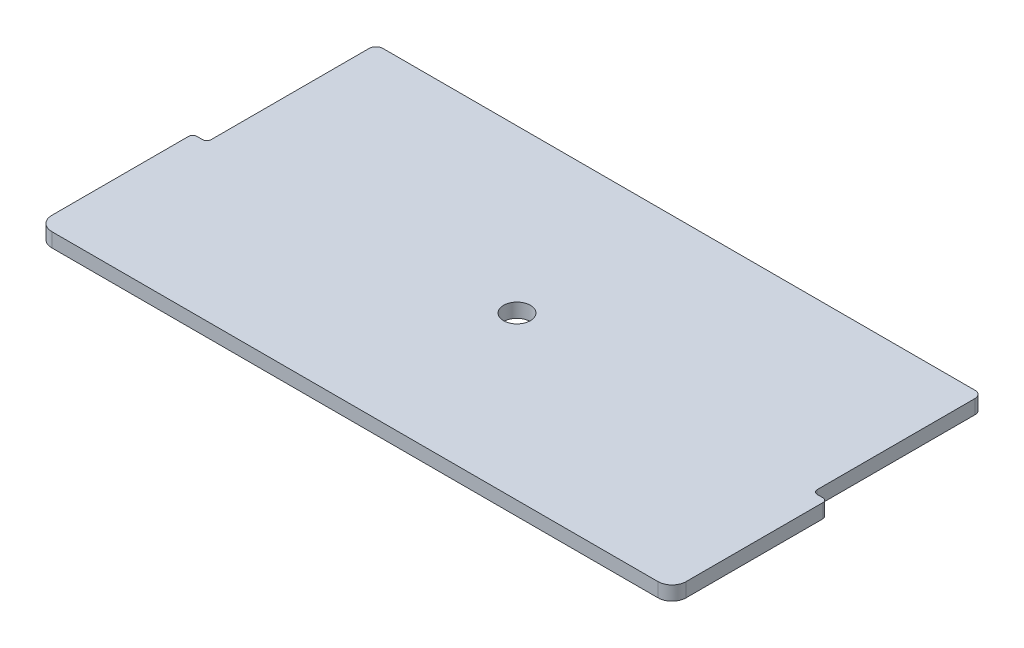
ISO-10303-21;
HEADER;
FILE_DESCRIPTION(('STEP AP214'),'2;1');
FILE_NAME('part.step','',(''),(''),'','','');
FILE_SCHEMA(('AUTOMOTIVE_DESIGN { 1 0 10303 214 1 1 1 1 }'));
ENDSEC;
DATA;
#1=APPLICATION_CONTEXT('core data for automotive mechanical design processes');
#2=APPLICATION_PROTOCOL_DEFINITION('international standard','automotive_design',2000,#1);
#3=PRODUCT_CONTEXT('',#1,'mechanical');
#4=PRODUCT('Part','Part','',(#3));
#5=PRODUCT_RELATED_PRODUCT_CATEGORY('part','',(#4));
#6=PRODUCT_DEFINITION_FORMATION('','',#4);
#7=PRODUCT_DEFINITION_CONTEXT('part definition',#1,'design');
#8=PRODUCT_DEFINITION('design','',#6,#7);
#9=PRODUCT_DEFINITION_SHAPE('','',#8);
#10=(LENGTH_UNIT() NAMED_UNIT(*) SI_UNIT(.MILLI.,.METRE.));
#11=(NAMED_UNIT(*) PLANE_ANGLE_UNIT() SI_UNIT($,.RADIAN.));
#12=(NAMED_UNIT(*) SI_UNIT($,.STERADIAN.) SOLID_ANGLE_UNIT());
#13=UNCERTAINTY_MEASURE_WITH_UNIT(LENGTH_MEASURE(1.E-05),#10,'distance_accuracy_value','');
#14=(GEOMETRIC_REPRESENTATION_CONTEXT(3) GLOBAL_UNCERTAINTY_ASSIGNED_CONTEXT((#13)) GLOBAL_UNIT_ASSIGNED_CONTEXT((#10,
#11,#12)) REPRESENTATION_CONTEXT('',''));
#15=CARTESIAN_POINT('',(0.,0.,0.));
#16=DIRECTION('',(0.,0.,1.));
#17=DIRECTION('',(1.,0.,0.));
#18=AXIS2_PLACEMENT_3D('',#15,#16,#17);
#19=CARTESIAN_POINT('',(-48.1701466086975,10.,-30.928495364833));
#20=DIRECTION('',(1.,0.,0.));
#21=DIRECTION('',(0.,0.,-1.));
#22=AXIS2_PLACEMENT_3D('',#19,#20,#21);
#23=PLANE('',#22);
#24=DIRECTION('',(0.,0.,1.));
#25=VECTOR('',#24,1.);
#26=CARTESIAN_POINT('',(-48.1701466086975,10.,-30.928495364833));
#27=LINE('',#26,#25);
#28=CARTESIAN_POINT('',(-48.1701466086974,10.,92.071504635167));
#29=VERTEX_POINT('',#28);
#30=CARTESIAN_POINT('',(-48.1701466086974,10.,189.071504635167));
#31=VERTEX_POINT('',#30);
#32=EDGE_CURVE('E174',#29,#31,#27,.T.);
#33=ORIENTED_EDGE('',*,*,#32,.F.);
#34=DIRECTION('',(0.,1.,0.));
#35=VECTOR('',#34,1.);
#36=CARTESIAN_POINT('',(-48.1701466086974,10.,92.071504635167));
#37=LINE('',#36,#35);
#38=CARTESIAN_POINT('',(-48.1701466086974,0.,92.071504635167));
#39=VERTEX_POINT('',#38);
#40=EDGE_CURVE('E200',#29,#39,#37,.F.);
#41=ORIENTED_EDGE('',*,*,#40,.T.);
#42=DIRECTION('',(0.,0.,1.));
#43=VECTOR('',#42,1.);
#44=CARTESIAN_POINT('',(-48.1701466086975,0.,-30.928495364833));
#45=LINE('',#44,#43);
#46=CARTESIAN_POINT('',(-48.1701466086974,0.,189.071504635167));
#47=VERTEX_POINT('',#46);
#48=EDGE_CURVE('E164',#39,#47,#45,.T.);
#49=ORIENTED_EDGE('',*,*,#48,.T.);
#50=DIRECTION('',(0.,-1.,0.));
#51=VECTOR('',#50,1.);
#52=CARTESIAN_POINT('',(-48.1701466086974,10.,189.071504635167));
#53=LINE('',#52,#51);
#54=EDGE_CURVE('E154',#47,#31,#53,.F.);
#55=ORIENTED_EDGE('',*,*,#54,.T.);
#56=EDGE_LOOP('',(#33,#41,#49,#55));
#57=FACE_BOUND('',#56,.T.);
#58=ADVANCED_FACE('F34',(#57),#23,.F.);
#59=CARTESIAN_POINT('',(-48.1701466086974,10.,199.071504635167));
#60=DIRECTION('',(0.,0.,-1.));
#61=DIRECTION('',(-1.,0.,0.));
#62=AXIS2_PLACEMENT_3D('',#59,#60,#61);
#63=PLANE('',#62);
#64=DIRECTION('',(1.,0.,0.));
#65=VECTOR('',#64,1.);
#66=CARTESIAN_POINT('',(-48.1701466086974,0.,199.071504635167));
#67=LINE('',#66,#65);
#68=CARTESIAN_POINT('',(-38.1701466086974,0.,199.071504635167));
#69=VERTEX_POINT('',#68);
#70=CARTESIAN_POINT('',(391.829853391303,0.,199.071504635167));
#71=VERTEX_POINT('',#70);
#72=EDGE_CURVE('E158',#69,#71,#67,.T.);
#73=ORIENTED_EDGE('',*,*,#72,.T.);
#74=DIRECTION('',(0.,-1.,0.));
#75=VECTOR('',#74,1.);
#76=CARTESIAN_POINT('',(391.829853391303,10.,199.071504635167));
#77=LINE('',#76,#75);
#78=CARTESIAN_POINT('',(391.829853391303,10.,199.071504635167));
#79=VERTEX_POINT('',#78);
#80=EDGE_CURVE('E42',#71,#79,#77,.F.);
#81=ORIENTED_EDGE('',*,*,#80,.T.);
#82=DIRECTION('',(1.,0.,0.));
#83=VECTOR('',#82,1.);
#84=CARTESIAN_POINT('',(-48.1701466086974,10.,199.071504635167));
#85=LINE('',#84,#83);
#86=CARTESIAN_POINT('',(-38.1701466086974,10.,199.071504635167));
#87=VERTEX_POINT('',#86);
#88=EDGE_CURVE('E159',#87,#79,#85,.T.);
#89=ORIENTED_EDGE('',*,*,#88,.F.);
#90=DIRECTION('',(0.,-1.,0.));
#91=VECTOR('',#90,1.);
#92=CARTESIAN_POINT('',(-38.1701466086974,10.,199.071504635167));
#93=LINE('',#92,#91);
#94=EDGE_CURVE('E152',#87,#69,#93,.T.);
#95=ORIENTED_EDGE('',*,*,#94,.T.);
#96=EDGE_LOOP('',(#73,#81,#89,#95));
#97=FACE_BOUND('',#96,.T.);
#98=ADVANCED_FACE('F157',(#97),#63,.F.);
#99=CARTESIAN_POINT('',(401.829853391302,10.,-30.928495364833));
#100=DIRECTION('',(-1.,0.,0.));
#101=DIRECTION('',(0.,0.,1.));
#102=AXIS2_PLACEMENT_3D('',#99,#100,#101);
#103=PLANE('',#102);
#104=DIRECTION('',(0.,0.,-1.));
#105=VECTOR('',#104,1.);
#106=CARTESIAN_POINT('',(401.829853391302,10.,-30.928495364833));
#107=LINE('',#106,#105);
#108=CARTESIAN_POINT('',(401.829853391303,10.,189.071504635167));
#109=VERTEX_POINT('',#108);
#110=CARTESIAN_POINT('',(401.829853391303,10.,92.071504635167));
#111=VERTEX_POINT('',#110);
#112=EDGE_CURVE('E252',#109,#111,#107,.T.);
#113=ORIENTED_EDGE('',*,*,#112,.F.);
#114=DIRECTION('',(0.,-1.,0.));
#115=VECTOR('',#114,1.);
#116=CARTESIAN_POINT('',(401.829853391303,10.,189.071504635167));
#117=LINE('',#116,#115);
#118=CARTESIAN_POINT('',(401.829853391303,0.,189.071504635167));
#119=VERTEX_POINT('',#118);
#120=EDGE_CURVE('E245',#109,#119,#117,.T.);
#121=ORIENTED_EDGE('',*,*,#120,.T.);
#122=DIRECTION('',(0.,0.,-1.));
#123=VECTOR('',#122,1.);
#124=CARTESIAN_POINT('',(401.829853391302,0.,-30.928495364833));
#125=LINE('',#124,#123);
#126=CARTESIAN_POINT('',(401.829853391303,0.,92.071504635167));
#127=VERTEX_POINT('',#126);
#128=EDGE_CURVE('E163',#119,#127,#125,.T.);
#129=ORIENTED_EDGE('',*,*,#128,.T.);
#130=DIRECTION('',(0.,1.,0.));
#131=VECTOR('',#130,1.);
#132=CARTESIAN_POINT('',(401.829853391303,10.,92.071504635167));
#133=LINE('',#132,#131);
#134=EDGE_CURVE('E226',#127,#111,#133,.T.);
#135=ORIENTED_EDGE('',*,*,#134,.T.);
#136=EDGE_LOOP('',(#113,#121,#129,#135));
#137=FACE_BOUND('',#136,.T.);
#138=ADVANCED_FACE('F251',(#137),#103,.F.);
#139=CARTESIAN_POINT('',(-48.1701466086975,10.,-30.928495364833));
#140=DIRECTION('',(0.,0.,1.));
#141=DIRECTION('',(1.,0.,0.));
#142=AXIS2_PLACEMENT_3D('',#139,#140,#141);
#143=PLANE('',#142);
#144=DIRECTION('',(-1.,0.,0.));
#145=VECTOR('',#144,1.);
#146=CARTESIAN_POINT('',(-48.1701466086975,10.,-30.928495364833));
#147=LINE('',#146,#145);
#148=CARTESIAN_POINT('',(386.829853391303,10.,-30.928495364833));
#149=VERTEX_POINT('',#148);
#150=CARTESIAN_POINT('',(-33.1701466086975,10.,-30.928495364833));
#151=VERTEX_POINT('',#150);
#152=EDGE_CURVE('E179',#149,#151,#147,.T.);
#153=ORIENTED_EDGE('',*,*,#152,.F.);
#154=DIRECTION('',(0.,1.,0.));
#155=VECTOR('',#154,1.);
#156=CARTESIAN_POINT('',(386.829853391303,10.,-30.928495364833));
#157=LINE('',#156,#155);
#158=CARTESIAN_POINT('',(386.829853391303,0.,-30.928495364833));
#159=VERTEX_POINT('',#158);
#160=EDGE_CURVE('E218',#149,#159,#157,.F.);
#161=ORIENTED_EDGE('',*,*,#160,.T.);
#162=DIRECTION('',(-1.,0.,0.));
#163=VECTOR('',#162,1.);
#164=CARTESIAN_POINT('',(-48.1701466086975,0.,-30.928495364833));
#165=LINE('',#164,#163);
#166=CARTESIAN_POINT('',(-33.1701466086975,0.,-30.928495364833));
#167=VERTEX_POINT('',#166);
#168=EDGE_CURVE('E166',#159,#167,#165,.T.);
#169=ORIENTED_EDGE('',*,*,#168,.T.);
#170=DIRECTION('',(0.,1.,0.));
#171=VECTOR('',#170,1.);
#172=CARTESIAN_POINT('',(-33.1701466086975,10.,-30.928495364833));
#173=LINE('',#172,#171);
#174=EDGE_CURVE('E215',#167,#151,#173,.T.);
#175=ORIENTED_EDGE('',*,*,#174,.T.);
#176=EDGE_LOOP('',(#153,#161,#169,#175));
#177=FACE_BOUND('',#176,.T.);
#178=ADVANCED_FACE('F289',(#177),#143,.F.);
#179=CARTESIAN_POINT('',(0.,10.,0.));
#180=DIRECTION('',(0.,1.,0.));
#181=DIRECTION('',(0.,0.,1.));
#182=AXIS2_PLACEMENT_3D('',#179,#180,#181);
#183=PLANE('',#182);
#184=CARTESIAN_POINT('',(176.829853391303,10.,84.071504635167));
#185=DIRECTION('',(0.,1.,0.));
#186=DIRECTION('',(0.,0.,1.));
#187=AXIS2_PLACEMENT_3D('',#184,#185,#186);
#188=CIRCLE('',#187,9.50000000000001);
#189=CARTESIAN_POINT('',(176.829853391303,10.,93.571504635167));
#190=VERTEX_POINT('',#189);
#191=EDGE_CURVE('E445',#190,#190,#188,.T.);
#192=ORIENTED_EDGE('',*,*,#191,.F.);
#193=EDGE_LOOP('',(#192));
#194=FACE_BOUND('',#193,.T.);
#195=ORIENTED_EDGE('',*,*,#88,.T.);
#196=CARTESIAN_POINT('',(391.829853391303,10.,189.071504635167));
#197=DIRECTION('',(0.,1.,0.));
#198=DIRECTION('',(0.,0.,1.));
#199=AXIS2_PLACEMENT_3D('',#196,#197,#198);
#200=CIRCLE('',#199,10.);
#201=EDGE_CURVE('E11',#79,#109,#200,.T.);
#202=ORIENTED_EDGE('',*,*,#201,.T.);
#203=ORIENTED_EDGE('',*,*,#112,.T.);
#204=CARTESIAN_POINT('',(398.829853391303,10.,92.071504635167));
#205=DIRECTION('',(0.,1.,0.));
#206=DIRECTION('',(0.,0.,1.));
#207=AXIS2_PLACEMENT_3D('',#204,#205,#206);
#208=CIRCLE('',#207,3.);
#209=CARTESIAN_POINT('',(398.829853391303,10.,89.071504635167));
#210=VERTEX_POINT('',#209);
#211=EDGE_CURVE('E229',#111,#210,#208,.T.);
#212=ORIENTED_EDGE('',*,*,#211,.T.);
#213=DIRECTION('',(1.,0.,0.));
#214=VECTOR('',#213,1.);
#215=CARTESIAN_POINT('',(401.829853391303,10.,89.071504635167));
#216=LINE('',#215,#214);
#217=CARTESIAN_POINT('',(394.829853391303,10.,89.071504635167));
#218=VERTEX_POINT('',#217);
#219=EDGE_CURVE('E266',#218,#210,#216,.T.);
#220=ORIENTED_EDGE('',*,*,#219,.F.);
#221=CARTESIAN_POINT('',(394.829853391303,10.,86.071504635167));
#222=DIRECTION('',(0.,1.,0.));
#223=DIRECTION('',(0.,0.,1.));
#224=AXIS2_PLACEMENT_3D('',#221,#222,#223);
#225=CIRCLE('',#224,3.);
#226=CARTESIAN_POINT('',(391.829853391303,10.,86.071504635167));
#227=VERTEX_POINT('',#226);
#228=EDGE_CURVE('E241',#218,#227,#225,.F.);
#229=ORIENTED_EDGE('',*,*,#228,.T.);
#230=DIRECTION('',(0.,0.,1.));
#231=VECTOR('',#230,1.);
#232=CARTESIAN_POINT('',(391.829853391303,10.,89.071504635167));
#233=LINE('',#232,#231);
#234=CARTESIAN_POINT('',(391.829853391303,10.,-25.928495364833));
#235=VERTEX_POINT('',#234);
#236=EDGE_CURVE('E271',#235,#227,#233,.T.);
#237=ORIENTED_EDGE('',*,*,#236,.F.);
#238=CARTESIAN_POINT('',(386.829853391303,10.,-25.928495364833));
#239=DIRECTION('',(0.,1.,0.));
#240=DIRECTION('',(0.,0.,1.));
#241=AXIS2_PLACEMENT_3D('',#238,#239,#240);
#242=CIRCLE('',#241,5.);
#243=EDGE_CURVE('E213',#235,#149,#242,.T.);
#244=ORIENTED_EDGE('',*,*,#243,.T.);
#245=ORIENTED_EDGE('',*,*,#152,.T.);
#246=CARTESIAN_POINT('',(-33.1701466086975,10.,-25.928495364833));
#247=DIRECTION('',(0.,1.,0.));
#248=DIRECTION('',(0.,0.,1.));
#249=AXIS2_PLACEMENT_3D('',#246,#247,#248);
#250=CIRCLE('',#249,5.);
#251=CARTESIAN_POINT('',(-38.1701466086975,10.,-25.928495364833));
#252=VERTEX_POINT('',#251);
#253=EDGE_CURVE('E211',#151,#252,#250,.T.);
#254=ORIENTED_EDGE('',*,*,#253,.T.);
#255=DIRECTION('',(0.,0.,-1.));
#256=VECTOR('',#255,1.);
#257=CARTESIAN_POINT('',(-38.1701466086975,10.,-30.928495364833));
#258=LINE('',#257,#256);
#259=CARTESIAN_POINT('',(-38.1701466086974,10.,86.071504635167));
#260=VERTEX_POINT('',#259);
#261=EDGE_CURVE('E168',#260,#252,#258,.T.);
#262=ORIENTED_EDGE('',*,*,#261,.F.);
#263=CARTESIAN_POINT('',(-41.1701466086974,10.,86.071504635167));
#264=DIRECTION('',(0.,1.,0.));
#265=DIRECTION('',(0.,0.,1.));
#266=AXIS2_PLACEMENT_3D('',#263,#264,#265);
#267=CIRCLE('',#266,3.);
#268=CARTESIAN_POINT('',(-41.1701466086974,10.,89.071504635167));
#269=VERTEX_POINT('',#268);
#270=EDGE_CURVE('E204',#260,#269,#267,.F.);
#271=ORIENTED_EDGE('',*,*,#270,.T.);
#272=DIRECTION('',(1.,0.,0.));
#273=VECTOR('',#272,1.);
#274=CARTESIAN_POINT('',(-48.1701466086974,10.,89.071504635167));
#275=LINE('',#274,#273);
#276=CARTESIAN_POINT('',(-45.1701466086974,10.,89.071504635167));
#277=VERTEX_POINT('',#276);
#278=EDGE_CURVE('E270',#277,#269,#275,.T.);
#279=ORIENTED_EDGE('',*,*,#278,.F.);
#280=CARTESIAN_POINT('',(-45.1701466086974,10.,92.071504635167));
#281=DIRECTION('',(0.,1.,0.));
#282=DIRECTION('',(0.,0.,1.));
#283=AXIS2_PLACEMENT_3D('',#280,#281,#282);
#284=CIRCLE('',#283,3.);
#285=EDGE_CURVE('E198',#277,#29,#284,.T.);
#286=ORIENTED_EDGE('',*,*,#285,.T.);
#287=ORIENTED_EDGE('',*,*,#32,.T.);
#288=CARTESIAN_POINT('',(-38.1701466086974,10.,189.071504635167));
#289=DIRECTION('',(0.,1.,0.));
#290=DIRECTION('',(0.,0.,1.));
#291=AXIS2_PLACEMENT_3D('',#288,#289,#290);
#292=CIRCLE('',#291,10.);
#293=EDGE_CURVE('E188',#31,#87,#292,.T.);
#294=ORIENTED_EDGE('',*,*,#293,.T.);
#295=EDGE_LOOP('',(#195,#202,#203,#212,#220,#229,#237,#244,#245,#254,#262,#271,#279,#286,#287,#294));
#296=FACE_BOUND('',#295,.T.);
#297=ADVANCED_FACE('F265',(#194,#296),#183,.T.);
#298=CARTESIAN_POINT('',(0.,0.,0.));
#299=DIRECTION('',(0.,1.,0.));
#300=DIRECTION('',(0.,0.,1.));
#301=AXIS2_PLACEMENT_3D('',#298,#299,#300);
#302=PLANE('',#301);
#303=CARTESIAN_POINT('',(176.829853391303,0.,84.071504635167));
#304=DIRECTION('',(0.,1.,0.));
#305=DIRECTION('',(0.,0.,1.));
#306=AXIS2_PLACEMENT_3D('',#303,#304,#305);
#307=CIRCLE('',#306,9.50000000000001);
#308=CARTESIAN_POINT('',(176.829853391303,0.,93.571504635167));
#309=VERTEX_POINT('',#308);
#310=EDGE_CURVE('E276',#309,#309,#307,.T.);
#311=ORIENTED_EDGE('',*,*,#310,.T.);
#312=EDGE_LOOP('',(#311));
#313=FACE_BOUND('',#312,.T.);
#314=ORIENTED_EDGE('',*,*,#128,.F.);
#315=CARTESIAN_POINT('',(391.829853391303,0.,189.071504635167));
#316=DIRECTION('',(0.,1.,0.));
#317=DIRECTION('',(0.,0.,1.));
#318=AXIS2_PLACEMENT_3D('',#315,#316,#317);
#319=CIRCLE('',#318,10.);
#320=EDGE_CURVE('E56',#119,#71,#319,.F.);
#321=ORIENTED_EDGE('',*,*,#320,.T.);
#322=ORIENTED_EDGE('',*,*,#72,.F.);
#323=CARTESIAN_POINT('',(-38.1701466086974,0.,189.071504635167));
#324=DIRECTION('',(0.,1.,0.));
#325=DIRECTION('',(0.,0.,1.));
#326=AXIS2_PLACEMENT_3D('',#323,#324,#325);
#327=CIRCLE('',#326,10.);
#328=EDGE_CURVE('E148',#69,#47,#327,.F.);
#329=ORIENTED_EDGE('',*,*,#328,.T.);
#330=ORIENTED_EDGE('',*,*,#48,.F.);
#331=CARTESIAN_POINT('',(-45.1701466086974,0.,92.071504635167));
#332=DIRECTION('',(0.,1.,0.));
#333=DIRECTION('',(0.,0.,1.));
#334=AXIS2_PLACEMENT_3D('',#331,#332,#333);
#335=CIRCLE('',#334,3.);
#336=CARTESIAN_POINT('',(-45.1701466086974,0.,89.071504635167));
#337=VERTEX_POINT('',#336);
#338=EDGE_CURVE('E202',#39,#337,#335,.F.);
#339=ORIENTED_EDGE('',*,*,#338,.T.);
#340=DIRECTION('',(1.,0.,0.));
#341=VECTOR('',#340,1.);
#342=CARTESIAN_POINT('',(-1.23611544104961E-13,0.,89.0715046351671));
#343=LINE('',#342,#341);
#344=CARTESIAN_POINT('',(-41.1701466086974,0.,89.071504635167));
#345=VERTEX_POINT('',#344);
#346=EDGE_CURVE('E182',#337,#345,#343,.T.);
#347=ORIENTED_EDGE('',*,*,#346,.T.);
#348=CARTESIAN_POINT('',(-41.1701466086974,0.,86.071504635167));
#349=DIRECTION('',(0.,1.,0.));
#350=DIRECTION('',(0.,0.,1.));
#351=AXIS2_PLACEMENT_3D('',#348,#349,#350);
#352=CIRCLE('',#351,3.);
#353=CARTESIAN_POINT('',(-38.1701466086974,0.,86.071504635167));
#354=VERTEX_POINT('',#353);
#355=EDGE_CURVE('E206',#345,#354,#352,.T.);
#356=ORIENTED_EDGE('',*,*,#355,.T.);
#357=DIRECTION('',(0.,0.,-1.));
#358=VECTOR('',#357,1.);
#359=CARTESIAN_POINT('',(-38.1701466086974,0.,0.));
#360=LINE('',#359,#358);
#361=CARTESIAN_POINT('',(-38.1701466086974,0.,-25.928495364833));
#362=VERTEX_POINT('',#361);
#363=EDGE_CURVE('E160',#354,#362,#360,.T.);
#364=ORIENTED_EDGE('',*,*,#363,.T.);
#365=CARTESIAN_POINT('',(-33.1701466086975,0.,-25.928495364833));
#366=DIRECTION('',(0.,1.,0.));
#367=DIRECTION('',(0.,0.,1.));
#368=AXIS2_PLACEMENT_3D('',#365,#366,#367);
#369=CIRCLE('',#368,5.);
#370=EDGE_CURVE('E220',#362,#167,#369,.F.);
#371=ORIENTED_EDGE('',*,*,#370,.T.);
#372=ORIENTED_EDGE('',*,*,#168,.F.);
#373=CARTESIAN_POINT('',(386.829853391303,0.,-25.928495364833));
#374=DIRECTION('',(0.,1.,0.));
#375=DIRECTION('',(0.,0.,1.));
#376=AXIS2_PLACEMENT_3D('',#373,#374,#375);
#377=CIRCLE('',#376,5.);
#378=CARTESIAN_POINT('',(391.829853391303,0.,-25.928495364833));
#379=VERTEX_POINT('',#378);
#380=EDGE_CURVE('E222',#159,#379,#377,.F.);
#381=ORIENTED_EDGE('',*,*,#380,.T.);
#382=DIRECTION('',(0.,0.,1.));
#383=VECTOR('',#382,1.);
#384=CARTESIAN_POINT('',(391.829853391303,0.,0.));
#385=LINE('',#384,#383);
#386=CARTESIAN_POINT('',(391.829853391303,0.,86.071504635167));
#387=VERTEX_POINT('',#386);
#388=EDGE_CURVE('E175',#379,#387,#385,.T.);
#389=ORIENTED_EDGE('',*,*,#388,.T.);
#390=CARTESIAN_POINT('',(394.829853391303,0.,86.071504635167));
#391=DIRECTION('',(0.,1.,0.));
#392=DIRECTION('',(0.,0.,1.));
#393=AXIS2_PLACEMENT_3D('',#390,#391,#392);
#394=CIRCLE('',#393,3.);
#395=CARTESIAN_POINT('',(394.829853391303,0.,89.071504635167));
#396=VERTEX_POINT('',#395);
#397=EDGE_CURVE('E243',#387,#396,#394,.T.);
#398=ORIENTED_EDGE('',*,*,#397,.T.);
#399=DIRECTION('',(1.,0.,0.));
#400=VECTOR('',#399,1.);
#401=CARTESIAN_POINT('',(0.,0.,89.071504635167));
#402=LINE('',#401,#400);
#403=CARTESIAN_POINT('',(398.829853391303,0.,89.071504635167));
#404=VERTEX_POINT('',#403);
#405=EDGE_CURVE('E178',#396,#404,#402,.T.);
#406=ORIENTED_EDGE('',*,*,#405,.T.);
#407=CARTESIAN_POINT('',(398.829853391303,0.,92.071504635167));
#408=DIRECTION('',(0.,1.,0.));
#409=DIRECTION('',(0.,0.,1.));
#410=AXIS2_PLACEMENT_3D('',#407,#408,#409);
#411=CIRCLE('',#410,3.);
#412=EDGE_CURVE('E236',#404,#127,#411,.F.);
#413=ORIENTED_EDGE('',*,*,#412,.T.);
#414=EDGE_LOOP('',(#314,#321,#322,#329,#330,#339,#347,#356,#364,#371,#372,#381,#389,#398,#406,#413));
#415=FACE_BOUND('',#414,.T.);
#416=ADVANCED_FACE('F162',(#313,#415),#302,.F.);
#417=CARTESIAN_POINT('',(401.829853391303,-276.,89.071504635167));
#418=DIRECTION('',(0.,0.,1.));
#419=DIRECTION('',(1.,0.,0.));
#420=AXIS2_PLACEMENT_3D('',#417,#418,#419);
#421=PLANE('',#420);
#422=ORIENTED_EDGE('',*,*,#219,.T.);
#423=DIRECTION('',(0.,1.,0.));
#424=VECTOR('',#423,1.);
#425=CARTESIAN_POINT('',(398.829853391303,-276.,89.071504635167));
#426=LINE('',#425,#424);
#427=EDGE_CURVE('E234',#210,#404,#426,.F.);
#428=ORIENTED_EDGE('',*,*,#427,.T.);
#429=ORIENTED_EDGE('',*,*,#405,.F.);
#430=DIRECTION('',(0.,1.,0.));
#431=VECTOR('',#430,1.);
#432=CARTESIAN_POINT('',(394.829853391303,10.,89.071504635167));
#433=LINE('',#432,#431);
#434=EDGE_CURVE('E231',#396,#218,#433,.T.);
#435=ORIENTED_EDGE('',*,*,#434,.T.);
#436=EDGE_LOOP('',(#422,#428,#429,#435));
#437=FACE_BOUND('',#436,.T.);
#438=ADVANCED_FACE('F268',(#437),#421,.F.);
#439=CARTESIAN_POINT('',(391.829853391303,-276.,89.071504635167));
#440=DIRECTION('',(-1.,0.,0.));
#441=DIRECTION('',(0.,0.,1.));
#442=AXIS2_PLACEMENT_3D('',#439,#440,#441);
#443=PLANE('',#442);
#444=ORIENTED_EDGE('',*,*,#236,.T.);
#445=DIRECTION('',(0.,1.,0.));
#446=VECTOR('',#445,1.);
#447=CARTESIAN_POINT('',(391.829853391303,0.,86.071504635167));
#448=LINE('',#447,#446);
#449=EDGE_CURVE('E239',#227,#387,#448,.F.);
#450=ORIENTED_EDGE('',*,*,#449,.T.);
#451=ORIENTED_EDGE('',*,*,#388,.F.);
#452=DIRECTION('',(0.,1.,0.));
#453=VECTOR('',#452,1.);
#454=CARTESIAN_POINT('',(391.829853391303,-276.,-25.928495364833));
#455=LINE('',#454,#453);
#456=EDGE_CURVE('E208',#379,#235,#455,.T.);
#457=ORIENTED_EDGE('',*,*,#456,.T.);
#458=EDGE_LOOP('',(#444,#450,#451,#457));
#459=FACE_BOUND('',#458,.T.);
#460=ADVANCED_FACE('F299',(#459),#443,.F.);
#461=CARTESIAN_POINT('',(-38.1701466086975,-276.,-30.928495364833));
#462=DIRECTION('',(1.,0.,0.));
#463=DIRECTION('',(0.,0.,-1.));
#464=AXIS2_PLACEMENT_3D('',#461,#462,#463);
#465=PLANE('',#464);
#466=ORIENTED_EDGE('',*,*,#261,.T.);
#467=DIRECTION('',(0.,1.,0.));
#468=VECTOR('',#467,1.);
#469=CARTESIAN_POINT('',(-38.1701466086975,-276.,-25.928495364833));
#470=LINE('',#469,#468);
#471=EDGE_CURVE('E224',#252,#362,#470,.F.);
#472=ORIENTED_EDGE('',*,*,#471,.T.);
#473=ORIENTED_EDGE('',*,*,#363,.F.);
#474=DIRECTION('',(0.,1.,0.));
#475=VECTOR('',#474,1.);
#476=CARTESIAN_POINT('',(-38.1701466086974,10.,86.071504635167));
#477=LINE('',#476,#475);
#478=EDGE_CURVE('E190',#354,#260,#477,.T.);
#479=ORIENTED_EDGE('',*,*,#478,.T.);
#480=EDGE_LOOP('',(#466,#472,#473,#479));
#481=FACE_BOUND('',#480,.T.);
#482=ADVANCED_FACE('F344',(#481),#465,.F.);
#483=CARTESIAN_POINT('',(-48.1701466086974,-276.,89.071504635167));
#484=DIRECTION('',(0.,0.,1.));
#485=DIRECTION('',(1.,0.,0.));
#486=AXIS2_PLACEMENT_3D('',#483,#484,#485);
#487=PLANE('',#486);
#488=ORIENTED_EDGE('',*,*,#278,.T.);
#489=DIRECTION('',(0.,1.,0.));
#490=VECTOR('',#489,1.);
#491=CARTESIAN_POINT('',(-41.1701466086974,0.,89.071504635167));
#492=LINE('',#491,#490);
#493=EDGE_CURVE('E196',#269,#345,#492,.F.);
#494=ORIENTED_EDGE('',*,*,#493,.T.);
#495=ORIENTED_EDGE('',*,*,#346,.F.);
#496=DIRECTION('',(0.,1.,0.));
#497=VECTOR('',#496,1.);
#498=CARTESIAN_POINT('',(-45.1701466086974,-276.,89.071504635167));
#499=LINE('',#498,#497);
#500=EDGE_CURVE('E193',#337,#277,#499,.T.);
#501=ORIENTED_EDGE('',*,*,#500,.T.);
#502=EDGE_LOOP('',(#488,#494,#495,#501));
#503=FACE_BOUND('',#502,.T.);
#504=ADVANCED_FACE('F324',(#503),#487,.F.);
#505=CARTESIAN_POINT('',(-38.1701466086974,10.,189.071504635167));
#506=DIRECTION('',(0.,-1.,0.));
#507=DIRECTION('',(0.,0.,-1.));
#508=AXIS2_PLACEMENT_3D('',#505,#506,#507);
#509=CYLINDRICAL_SURFACE('',#508,10.);
#510=ORIENTED_EDGE('',*,*,#293,.F.);
#511=ORIENTED_EDGE('',*,*,#54,.F.);
#512=ORIENTED_EDGE('',*,*,#328,.F.);
#513=ORIENTED_EDGE('',*,*,#94,.F.);
#514=EDGE_LOOP('',(#510,#511,#512,#513));
#515=FACE_BOUND('',#514,.T.);
#516=ADVANCED_FACE('F151',(#515),#509,.T.);
#517=CARTESIAN_POINT('',(-41.1701466086974,-276.,86.071504635167));
#518=DIRECTION('',(0.,-1.,0.));
#519=DIRECTION('',(0.,0.,-1.));
#520=AXIS2_PLACEMENT_3D('',#517,#518,#519);
#521=CYLINDRICAL_SURFACE('',#520,3.);
#522=ORIENTED_EDGE('',*,*,#355,.F.);
#523=ORIENTED_EDGE('',*,*,#493,.F.);
#524=ORIENTED_EDGE('',*,*,#270,.F.);
#525=ORIENTED_EDGE('',*,*,#478,.F.);
#526=EDGE_LOOP('',(#522,#523,#524,#525));
#527=FACE_BOUND('',#526,.T.);
#528=ADVANCED_FACE('F323',(#527),#521,.F.);
#529=CARTESIAN_POINT('',(-45.1701466086974,-276.,92.071504635167));
#530=DIRECTION('',(0.,1.,0.));
#531=DIRECTION('',(0.,0.,1.));
#532=AXIS2_PLACEMENT_3D('',#529,#530,#531);
#533=CYLINDRICAL_SURFACE('',#532,3.);
#534=ORIENTED_EDGE('',*,*,#338,.F.);
#535=ORIENTED_EDGE('',*,*,#40,.F.);
#536=ORIENTED_EDGE('',*,*,#285,.F.);
#537=ORIENTED_EDGE('',*,*,#500,.F.);
#538=EDGE_LOOP('',(#534,#535,#536,#537));
#539=FACE_BOUND('',#538,.T.);
#540=ADVANCED_FACE('F327',(#539),#533,.T.);
#541=CARTESIAN_POINT('',(386.829853391303,-276.,-25.928495364833));
#542=DIRECTION('',(0.,1.,0.));
#543=DIRECTION('',(0.,0.,1.));
#544=AXIS2_PLACEMENT_3D('',#541,#542,#543);
#545=CYLINDRICAL_SURFACE('',#544,5.);
#546=ORIENTED_EDGE('',*,*,#380,.F.);
#547=ORIENTED_EDGE('',*,*,#160,.F.);
#548=ORIENTED_EDGE('',*,*,#243,.F.);
#549=ORIENTED_EDGE('',*,*,#456,.F.);
#550=EDGE_LOOP('',(#546,#547,#548,#549));
#551=FACE_BOUND('',#550,.T.);
#552=ADVANCED_FACE('F294',(#551),#545,.T.);
#553=CARTESIAN_POINT('',(-33.1701466086975,10.,-25.928495364833));
#554=DIRECTION('',(0.,1.,0.));
#555=DIRECTION('',(0.,0.,1.));
#556=AXIS2_PLACEMENT_3D('',#553,#554,#555);
#557=CYLINDRICAL_SURFACE('',#556,5.);
#558=ORIENTED_EDGE('',*,*,#370,.F.);
#559=ORIENTED_EDGE('',*,*,#471,.F.);
#560=ORIENTED_EDGE('',*,*,#253,.F.);
#561=ORIENTED_EDGE('',*,*,#174,.F.);
#562=EDGE_LOOP('',(#558,#559,#560,#561));
#563=FACE_BOUND('',#562,.T.);
#564=ADVANCED_FACE('F309',(#563),#557,.T.);
#565=CARTESIAN_POINT('',(398.829853391303,10.,92.071504635167));
#566=DIRECTION('',(0.,1.,0.));
#567=DIRECTION('',(0.,0.,1.));
#568=AXIS2_PLACEMENT_3D('',#565,#566,#567);
#569=CYLINDRICAL_SURFACE('',#568,3.);
#570=ORIENTED_EDGE('',*,*,#412,.F.);
#571=ORIENTED_EDGE('',*,*,#427,.F.);
#572=ORIENTED_EDGE('',*,*,#211,.F.);
#573=ORIENTED_EDGE('',*,*,#134,.F.);
#574=EDGE_LOOP('',(#570,#571,#572,#573));
#575=FACE_BOUND('',#574,.T.);
#576=ADVANCED_FACE('F261',(#575),#569,.T.);
#577=CARTESIAN_POINT('',(394.829853391303,-276.,86.071504635167));
#578=DIRECTION('',(0.,-1.,0.));
#579=DIRECTION('',(0.,0.,-1.));
#580=AXIS2_PLACEMENT_3D('',#577,#578,#579);
#581=CYLINDRICAL_SURFACE('',#580,3.);
#582=ORIENTED_EDGE('',*,*,#397,.F.);
#583=ORIENTED_EDGE('',*,*,#449,.F.);
#584=ORIENTED_EDGE('',*,*,#228,.F.);
#585=ORIENTED_EDGE('',*,*,#434,.F.);
#586=EDGE_LOOP('',(#582,#583,#584,#585));
#587=FACE_BOUND('',#586,.T.);
#588=ADVANCED_FACE('F302',(#587),#581,.F.);
#589=CARTESIAN_POINT('',(391.829853391303,10.,189.071504635167));
#590=DIRECTION('',(0.,-1.,0.));
#591=DIRECTION('',(0.,0.,-1.));
#592=AXIS2_PLACEMENT_3D('',#589,#590,#591);
#593=CYLINDRICAL_SURFACE('',#592,10.);
#594=ORIENTED_EDGE('',*,*,#201,.F.);
#595=ORIENTED_EDGE('',*,*,#80,.F.);
#596=ORIENTED_EDGE('',*,*,#320,.F.);
#597=ORIENTED_EDGE('',*,*,#120,.F.);
#598=EDGE_LOOP('',(#594,#595,#596,#597));
#599=FACE_BOUND('',#598,.T.);
#600=ADVANCED_FACE('F36',(#599),#593,.T.);
#601=CARTESIAN_POINT('',(176.829853391303,0.,84.071504635167));
#602=DIRECTION('',(0.,1.,0.));
#603=DIRECTION('',(0.,0.,1.));
#604=AXIS2_PLACEMENT_3D('',#601,#602,#603);
#605=CYLINDRICAL_SURFACE('',#604,9.50000000000001);
#606=ORIENTED_EDGE('',*,*,#310,.F.);
#607=EDGE_LOOP('',(#606));
#608=FACE_BOUND('',#607,.T.);
#609=ORIENTED_EDGE('',*,*,#191,.T.);
#610=EDGE_LOOP('',(#609));
#611=FACE_BOUND('',#610,.T.);
#612=ADVANCED_FACE('F308',(#608,#611),#605,.F.);
#613=CLOSED_SHELL('',(#58,#98,#138,#178,#297,#416,#438,#460,#482,#504,#516,#528,#540,#552,#564,
#576,#588,#600,#612));
#614=MANIFOLD_SOLID_BREP('B2',#613);
#615=ADVANCED_BREP_SHAPE_REPRESENTATION('',(#18,#614),#14);
#616=SHAPE_DEFINITION_REPRESENTATION(#9,#615);
ENDSEC;
END-ISO-10303-21;
